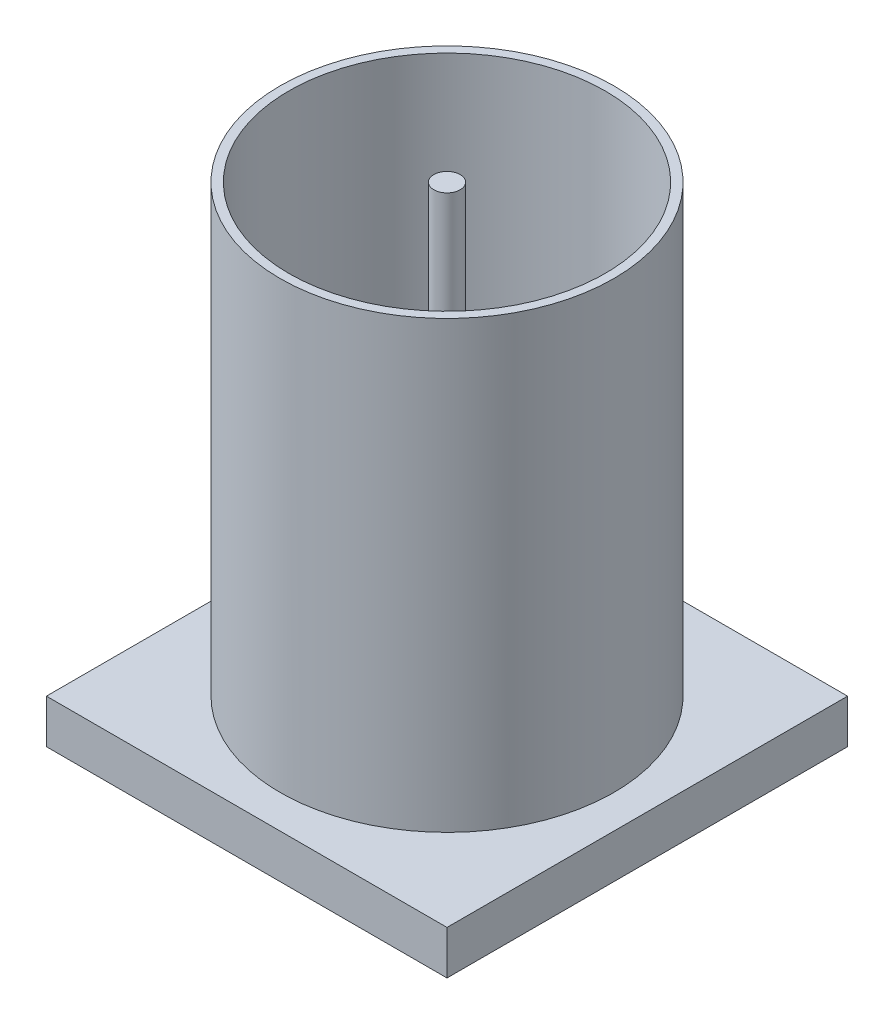
ISO-10303-21;
HEADER;
FILE_DESCRIPTION(('STEP AP214'),'2;1');
FILE_NAME('part.step','',(''),(''),'','','');
FILE_SCHEMA(('AUTOMOTIVE_DESIGN { 1 0 10303 214 1 1 1 1 }'));
ENDSEC;
DATA;
#1=APPLICATION_CONTEXT('core data for automotive mechanical design processes');
#2=APPLICATION_PROTOCOL_DEFINITION('international standard','automotive_design',2000,#1);
#3=PRODUCT_CONTEXT('',#1,'mechanical');
#4=PRODUCT('Part','Part','',(#3));
#5=PRODUCT_RELATED_PRODUCT_CATEGORY('part','',(#4));
#6=PRODUCT_DEFINITION_FORMATION('','',#4);
#7=PRODUCT_DEFINITION_CONTEXT('part definition',#1,'design');
#8=PRODUCT_DEFINITION('design','',#6,#7);
#9=PRODUCT_DEFINITION_SHAPE('','',#8);
#10=(LENGTH_UNIT() NAMED_UNIT(*) SI_UNIT(.MILLI.,.METRE.));
#11=(NAMED_UNIT(*) PLANE_ANGLE_UNIT() SI_UNIT($,.RADIAN.));
#12=(NAMED_UNIT(*) SI_UNIT($,.STERADIAN.) SOLID_ANGLE_UNIT());
#13=UNCERTAINTY_MEASURE_WITH_UNIT(LENGTH_MEASURE(1.E-05),#10,'distance_accuracy_value','');
#14=(GEOMETRIC_REPRESENTATION_CONTEXT(3) GLOBAL_UNCERTAINTY_ASSIGNED_CONTEXT((#13)) GLOBAL_UNIT_ASSIGNED_CONTEXT((#10,
#11,#12)) REPRESENTATION_CONTEXT('',''));
#15=CARTESIAN_POINT('',(0.,0.,0.));
#16=DIRECTION('',(0.,0.,1.));
#17=DIRECTION('',(1.,0.,0.));
#18=AXIS2_PLACEMENT_3D('',#15,#16,#17);
#19=CARTESIAN_POINT('',(0.,5.58,0.));
#20=DIRECTION('',(0.,-1.,0.));
#21=DIRECTION('',(0.,0.,-1.));
#22=AXIS2_PLACEMENT_3D('',#19,#20,#21);
#23=CYLINDRICAL_SURFACE('',#22,0.15);
#24=CARTESIAN_POINT('',(0.,5.58,0.));
#25=DIRECTION('',(0.,1.,0.));
#26=DIRECTION('',(0.,0.,1.));
#27=AXIS2_PLACEMENT_3D('',#24,#25,#26);
#28=CIRCLE('',#27,0.15);
#29=CARTESIAN_POINT('',(0.,5.58,0.15));
#30=VERTEX_POINT('',#29);
#31=EDGE_CURVE('E11',#30,#30,#28,.T.);
#32=ORIENTED_EDGE('',*,*,#31,.F.);
#33=EDGE_LOOP('',(#32));
#34=FACE_BOUND('',#33,.T.);
#35=CARTESIAN_POINT('',(0.,0.5,0.));
#36=DIRECTION('',(0.,1.,0.));
#37=DIRECTION('',(0.,0.,1.));
#38=AXIS2_PLACEMENT_3D('',#35,#36,#37);
#39=CIRCLE('',#38,0.15);
#40=CARTESIAN_POINT('',(0.,0.5,0.15));
#41=VERTEX_POINT('',#40);
#42=EDGE_CURVE('E52',#41,#41,#39,.T.);
#43=ORIENTED_EDGE('',*,*,#42,.T.);
#44=EDGE_LOOP('',(#43));
#45=FACE_BOUND('',#44,.T.);
#46=ADVANCED_FACE('F49',(#34,#45),#23,.T.);
#47=CARTESIAN_POINT('',(0.,5.58,0.));
#48=DIRECTION('',(0.,1.,0.));
#49=DIRECTION('',(0.,0.,1.));
#50=AXIS2_PLACEMENT_3D('',#47,#48,#49);
#51=PLANE('',#50);
#52=ORIENTED_EDGE('',*,*,#31,.T.);
#53=EDGE_LOOP('',(#52));
#54=FACE_BOUND('',#53,.T.);
#55=ADVANCED_FACE('F64',(#54),#51,.T.);
#56=CARTESIAN_POINT('',(0.,0.5,0.));
#57=DIRECTION('',(0.,1.,0.));
#58=DIRECTION('',(0.,0.,1.));
#59=AXIS2_PLACEMENT_3D('',#56,#57,#58);
#60=PLANE('',#59);
#61=ORIENTED_EDGE('',*,*,#42,.F.);
#62=EDGE_LOOP('',(#61));
#63=FACE_BOUND('',#62,.T.);
#64=ADVANCED_FACE('F62',(#63),#60,.F.);
#65=CLOSED_SHELL('',(#46,#55,#64));
#66=MANIFOLD_SOLID_BREP('B2',#65);
#67=CARTESIAN_POINT('',(0.,0.5,0.));
#68=DIRECTION('',(0.,-1.,0.));
#69=DIRECTION('',(0.,0.,-1.));
#70=AXIS2_PLACEMENT_3D('',#67,#68,#69);
#71=PLANE('',#70);
#72=DIRECTION('',(0.,0.,-1.));
#73=VECTOR('',#72,1.);
#74=CARTESIAN_POINT('',(2.286,0.5,2.286));
#75=LINE('',#74,#73);
#76=CARTESIAN_POINT('',(2.286,0.5,2.286));
#77=VERTEX_POINT('',#76);
#78=CARTESIAN_POINT('',(2.286,0.5,-2.286));
#79=VERTEX_POINT('',#78);
#80=EDGE_CURVE('E233',#77,#79,#75,.T.);
#81=ORIENTED_EDGE('',*,*,#80,.T.);
#82=DIRECTION('',(-1.,0.,0.));
#83=VECTOR('',#82,1.);
#84=CARTESIAN_POINT('',(-2.286,0.5,-2.286));
#85=LINE('',#84,#83);
#86=CARTESIAN_POINT('',(-2.286,0.5,-2.286));
#87=VERTEX_POINT('',#86);
#88=EDGE_CURVE('E140',#79,#87,#85,.T.);
#89=ORIENTED_EDGE('',*,*,#88,.T.);
#90=DIRECTION('',(0.,0.,1.));
#91=VECTOR('',#90,1.);
#92=CARTESIAN_POINT('',(-2.286,0.5,2.286));
#93=LINE('',#92,#91);
#94=CARTESIAN_POINT('',(-2.286,0.5,2.286));
#95=VERTEX_POINT('',#94);
#96=EDGE_CURVE('E238',#87,#95,#93,.T.);
#97=ORIENTED_EDGE('',*,*,#96,.T.);
#98=DIRECTION('',(1.,0.,0.));
#99=VECTOR('',#98,1.);
#100=CARTESIAN_POINT('',(-2.286,0.5,2.286));
#101=LINE('',#100,#99);
#102=EDGE_CURVE('E108',#95,#77,#101,.T.);
#103=ORIENTED_EDGE('',*,*,#102,.T.);
#104=EDGE_LOOP('',(#81,#89,#97,#103));
#105=FACE_BOUND('',#104,.T.);
#106=CARTESIAN_POINT('',(0.,0.5,0.));
#107=DIRECTION('',(0.,-1.,0.));
#108=DIRECTION('',(0.,0.,-1.));
#109=AXIS2_PLACEMENT_3D('',#106,#107,#108);
#110=CIRCLE('',#109,1.905);
#111=CARTESIAN_POINT('',(0.,0.5,-1.905));
#112=VERTEX_POINT('',#111);
#113=EDGE_CURVE('E47',#112,#112,#110,.F.);
#114=ORIENTED_EDGE('',*,*,#113,.F.);
#115=EDGE_LOOP('',(#114));
#116=FACE_BOUND('',#115,.T.);
#117=ADVANCED_FACE('F90',(#105,#116),#71,.F.);
#118=CARTESIAN_POINT('',(2.286,0.5,2.286));
#119=DIRECTION('',(-1.,0.,0.));
#120=DIRECTION('',(0.,0.,1.));
#121=AXIS2_PLACEMENT_3D('',#118,#119,#120);
#122=PLANE('',#121);
#123=DIRECTION('',(0.,0.,-1.));
#124=VECTOR('',#123,1.);
#125=CARTESIAN_POINT('',(2.286,0.,2.286));
#126=LINE('',#125,#124);
#127=CARTESIAN_POINT('',(2.286,0.,2.286));
#128=VERTEX_POINT('',#127);
#129=CARTESIAN_POINT('',(2.286,0.,-2.286));
#130=VERTEX_POINT('',#129);
#131=EDGE_CURVE('E232',#128,#130,#126,.T.);
#132=ORIENTED_EDGE('',*,*,#131,.T.);
#133=DIRECTION('',(0.,-1.,0.));
#134=VECTOR('',#133,1.);
#135=CARTESIAN_POINT('',(2.286,0.5,-2.286));
#136=LINE('',#135,#134);
#137=EDGE_CURVE('E100',#79,#130,#136,.T.);
#138=ORIENTED_EDGE('',*,*,#137,.F.);
#139=ORIENTED_EDGE('',*,*,#80,.F.);
#140=DIRECTION('',(0.,-1.,0.));
#141=VECTOR('',#140,1.);
#142=CARTESIAN_POINT('',(2.286,0.5,2.286));
#143=LINE('',#142,#141);
#144=EDGE_CURVE('E243',#77,#128,#143,.T.);
#145=ORIENTED_EDGE('',*,*,#144,.T.);
#146=EDGE_LOOP('',(#132,#138,#139,#145));
#147=FACE_BOUND('',#146,.T.);
#148=ADVANCED_FACE('F92',(#147),#122,.F.);
#149=CARTESIAN_POINT('',(-2.286,0.5,-2.286));
#150=DIRECTION('',(0.,0.,1.));
#151=DIRECTION('',(1.,0.,0.));
#152=AXIS2_PLACEMENT_3D('',#149,#150,#151);
#153=PLANE('',#152);
#154=DIRECTION('',(-1.,0.,0.));
#155=VECTOR('',#154,1.);
#156=CARTESIAN_POINT('',(-2.286,0.,-2.286));
#157=LINE('',#156,#155);
#158=CARTESIAN_POINT('',(-2.286,0.,-2.286));
#159=VERTEX_POINT('',#158);
#160=EDGE_CURVE('E247',#130,#159,#157,.T.);
#161=ORIENTED_EDGE('',*,*,#160,.T.);
#162=DIRECTION('',(0.,-1.,0.));
#163=VECTOR('',#162,1.);
#164=CARTESIAN_POINT('',(-2.286,0.5,-2.286));
#165=LINE('',#164,#163);
#166=EDGE_CURVE('E259',#87,#159,#165,.T.);
#167=ORIENTED_EDGE('',*,*,#166,.F.);
#168=ORIENTED_EDGE('',*,*,#88,.F.);
#169=ORIENTED_EDGE('',*,*,#137,.T.);
#170=EDGE_LOOP('',(#161,#167,#168,#169));
#171=FACE_BOUND('',#170,.T.);
#172=ADVANCED_FACE('F263',(#171),#153,.F.);
#173=CARTESIAN_POINT('',(-2.286,0.5,2.286));
#174=DIRECTION('',(1.,0.,0.));
#175=DIRECTION('',(0.,0.,-1.));
#176=AXIS2_PLACEMENT_3D('',#173,#174,#175);
#177=PLANE('',#176);
#178=DIRECTION('',(0.,0.,1.));
#179=VECTOR('',#178,1.);
#180=CARTESIAN_POINT('',(-2.286,0.,2.286));
#181=LINE('',#180,#179);
#182=CARTESIAN_POINT('',(-2.286,0.,2.286));
#183=VERTEX_POINT('',#182);
#184=EDGE_CURVE('E126',#159,#183,#181,.T.);
#185=ORIENTED_EDGE('',*,*,#184,.T.);
#186=DIRECTION('',(0.,-1.,0.));
#187=VECTOR('',#186,1.);
#188=CARTESIAN_POINT('',(-2.286,0.5,2.286));
#189=LINE('',#188,#187);
#190=EDGE_CURVE('E256',#95,#183,#189,.T.);
#191=ORIENTED_EDGE('',*,*,#190,.F.);
#192=ORIENTED_EDGE('',*,*,#96,.F.);
#193=ORIENTED_EDGE('',*,*,#166,.T.);
#194=EDGE_LOOP('',(#185,#191,#192,#193));
#195=FACE_BOUND('',#194,.T.);
#196=ADVANCED_FACE('F280',(#195),#177,.F.);
#197=CARTESIAN_POINT('',(-2.286,0.5,2.286));
#198=DIRECTION('',(0.,0.,-1.));
#199=DIRECTION('',(-1.,0.,0.));
#200=AXIS2_PLACEMENT_3D('',#197,#198,#199);
#201=PLANE('',#200);
#202=DIRECTION('',(1.,0.,0.));
#203=VECTOR('',#202,1.);
#204=CARTESIAN_POINT('',(-2.286,0.,2.286));
#205=LINE('',#204,#203);
#206=EDGE_CURVE('E132',#183,#128,#205,.T.);
#207=ORIENTED_EDGE('',*,*,#206,.T.);
#208=ORIENTED_EDGE('',*,*,#144,.F.);
#209=ORIENTED_EDGE('',*,*,#102,.F.);
#210=ORIENTED_EDGE('',*,*,#190,.T.);
#211=EDGE_LOOP('',(#207,#208,#209,#210));
#212=FACE_BOUND('',#211,.T.);
#213=ADVANCED_FACE('F271',(#212),#201,.F.);
#214=CARTESIAN_POINT('',(0.,0.,0.));
#215=DIRECTION('',(0.,-1.,0.));
#216=DIRECTION('',(0.,0.,-1.));
#217=AXIS2_PLACEMENT_3D('',#214,#215,#216);
#218=PLANE('',#217);
#219=ORIENTED_EDGE('',*,*,#131,.F.);
#220=ORIENTED_EDGE('',*,*,#206,.F.);
#221=ORIENTED_EDGE('',*,*,#184,.F.);
#222=ORIENTED_EDGE('',*,*,#160,.F.);
#223=EDGE_LOOP('',(#219,#220,#221,#222));
#224=FACE_BOUND('',#223,.T.);
#225=ADVANCED_FACE('F268',(#224),#218,.T.);
#226=CARTESIAN_POINT('',(0.,5.58,0.));
#227=DIRECTION('',(0.,-1.,0.));
#228=DIRECTION('',(0.,0.,-1.));
#229=AXIS2_PLACEMENT_3D('',#226,#227,#228);
#230=CYLINDRICAL_SURFACE('',#229,1.905);
#231=CARTESIAN_POINT('',(0.,5.58,0.));
#232=DIRECTION('',(0.,1.,0.));
#233=DIRECTION('',(0.,0.,1.));
#234=AXIS2_PLACEMENT_3D('',#231,#232,#233);
#235=CIRCLE('',#234,1.905);
#236=CARTESIAN_POINT('',(0.,5.58,1.905));
#237=VERTEX_POINT('',#236);
#238=EDGE_CURVE('E205',#237,#237,#235,.T.);
#239=ORIENTED_EDGE('',*,*,#238,.F.);
#240=EDGE_LOOP('',(#239));
#241=FACE_BOUND('',#240,.T.);
#242=ORIENTED_EDGE('',*,*,#113,.T.);
#243=EDGE_LOOP('',(#242));
#244=FACE_BOUND('',#243,.T.);
#245=ADVANCED_FACE('F270',(#241,#244),#230,.T.);
#246=CARTESIAN_POINT('',(0.,5.58,0.));
#247=DIRECTION('',(0.,1.,0.));
#248=DIRECTION('',(0.,0.,1.));
#249=AXIS2_PLACEMENT_3D('',#246,#247,#248);
#250=PLANE('',#249);
#251=CARTESIAN_POINT('',(0.,5.58,0.));
#252=DIRECTION('',(0.,1.,0.));
#253=DIRECTION('',(0.,0.,1.));
#254=AXIS2_PLACEMENT_3D('',#251,#252,#253);
#255=CIRCLE('',#254,1.805);
#256=CARTESIAN_POINT('',(0.,5.58,1.805));
#257=VERTEX_POINT('',#256);
#258=EDGE_CURVE('E211',#257,#257,#255,.T.);
#259=ORIENTED_EDGE('',*,*,#258,.F.);
#260=EDGE_LOOP('',(#259));
#261=FACE_BOUND('',#260,.T.);
#262=ORIENTED_EDGE('',*,*,#238,.T.);
#263=EDGE_LOOP('',(#262));
#264=FACE_BOUND('',#263,.T.);
#265=ADVANCED_FACE('F277',(#261,#264),#250,.T.);
#266=CARTESIAN_POINT('',(0.,0.4,0.));
#267=DIRECTION('',(0.,-1.,0.));
#268=DIRECTION('',(0.,0.,-1.));
#269=AXIS2_PLACEMENT_3D('',#266,#267,#268);
#270=PLANE('',#269);
#271=DIRECTION('',(0.,0.,-1.));
#272=VECTOR('',#271,1.);
#273=CARTESIAN_POINT('',(2.186,0.4,0.));
#274=LINE('',#273,#272);
#275=CARTESIAN_POINT('',(2.186,0.4,2.186));
#276=VERTEX_POINT('',#275);
#277=CARTESIAN_POINT('',(2.186,0.4,-2.186));
#278=VERTEX_POINT('',#277);
#279=EDGE_CURVE('E180',#276,#278,#274,.T.);
#280=ORIENTED_EDGE('',*,*,#279,.F.);
#281=DIRECTION('',(1.,0.,0.));
#282=VECTOR('',#281,1.);
#283=CARTESIAN_POINT('',(0.,0.4,2.186));
#284=LINE('',#283,#282);
#285=CARTESIAN_POINT('',(-2.186,0.4,2.186));
#286=VERTEX_POINT('',#285);
#287=EDGE_CURVE('E193',#286,#276,#284,.T.);
#288=ORIENTED_EDGE('',*,*,#287,.F.);
#289=DIRECTION('',(0.,0.,1.));
#290=VECTOR('',#289,1.);
#291=CARTESIAN_POINT('',(-2.186,0.4,0.));
#292=LINE('',#291,#290);
#293=CARTESIAN_POINT('',(-2.186,0.4,-2.186));
#294=VERTEX_POINT('',#293);
#295=EDGE_CURVE('E179',#294,#286,#292,.T.);
#296=ORIENTED_EDGE('',*,*,#295,.F.);
#297=DIRECTION('',(-1.,0.,0.));
#298=VECTOR('',#297,1.);
#299=CARTESIAN_POINT('',(0.,0.4,-2.186));
#300=LINE('',#299,#298);
#301=EDGE_CURVE('E167',#278,#294,#300,.T.);
#302=ORIENTED_EDGE('',*,*,#301,.F.);
#303=EDGE_LOOP('',(#280,#288,#296,#302));
#304=FACE_BOUND('',#303,.T.);
#305=CARTESIAN_POINT('',(0.,0.4,0.));
#306=DIRECTION('',(0.,-1.,0.));
#307=DIRECTION('',(0.,0.,-1.));
#308=AXIS2_PLACEMENT_3D('',#305,#306,#307);
#309=CIRCLE('',#308,1.805);
#310=CARTESIAN_POINT('',(0.,0.4,-1.805));
#311=VERTEX_POINT('',#310);
#312=EDGE_CURVE('E201',#311,#311,#309,.F.);
#313=ORIENTED_EDGE('',*,*,#312,.T.);
#314=EDGE_LOOP('',(#313));
#315=FACE_BOUND('',#314,.T.);
#316=ADVANCED_FACE('F191',(#304,#315),#270,.T.);
#317=CARTESIAN_POINT('',(2.186,0.5,2.286));
#318=DIRECTION('',(-1.,0.,0.));
#319=DIRECTION('',(0.,0.,1.));
#320=AXIS2_PLACEMENT_3D('',#317,#318,#319);
#321=PLANE('',#320);
#322=DIRECTION('',(0.,0.,-1.));
#323=VECTOR('',#322,1.);
#324=CARTESIAN_POINT('',(2.186,0.1,0.));
#325=LINE('',#324,#323);
#326=CARTESIAN_POINT('',(2.186,0.1,2.186));
#327=VERTEX_POINT('',#326);
#328=CARTESIAN_POINT('',(2.186,0.1,-2.186));
#329=VERTEX_POINT('',#328);
#330=EDGE_CURVE('E206',#327,#329,#325,.T.);
#331=ORIENTED_EDGE('',*,*,#330,.F.);
#332=DIRECTION('',(0.,-1.,0.));
#333=VECTOR('',#332,1.);
#334=CARTESIAN_POINT('',(2.186,0.5,2.186));
#335=LINE('',#334,#333);
#336=EDGE_CURVE('E197',#276,#327,#335,.T.);
#337=ORIENTED_EDGE('',*,*,#336,.F.);
#338=ORIENTED_EDGE('',*,*,#279,.T.);
#339=DIRECTION('',(0.,-1.,0.));
#340=VECTOR('',#339,1.);
#341=CARTESIAN_POINT('',(2.186,0.5,-2.186));
#342=LINE('',#341,#340);
#343=EDGE_CURVE('E173',#278,#329,#342,.T.);
#344=ORIENTED_EDGE('',*,*,#343,.T.);
#345=EDGE_LOOP('',(#331,#337,#338,#344));
#346=FACE_BOUND('',#345,.T.);
#347=ADVANCED_FACE('F308',(#346),#321,.T.);
#348=CARTESIAN_POINT('',(-2.286,0.5,-2.186));
#349=DIRECTION('',(0.,0.,1.));
#350=DIRECTION('',(1.,0.,0.));
#351=AXIS2_PLACEMENT_3D('',#348,#349,#350);
#352=PLANE('',#351);
#353=DIRECTION('',(-1.,0.,0.));
#354=VECTOR('',#353,1.);
#355=CARTESIAN_POINT('',(0.,0.1,-2.186));
#356=LINE('',#355,#354);
#357=CARTESIAN_POINT('',(-2.186,0.1,-2.186));
#358=VERTEX_POINT('',#357);
#359=EDGE_CURVE('E210',#329,#358,#356,.T.);
#360=ORIENTED_EDGE('',*,*,#359,.F.);
#361=ORIENTED_EDGE('',*,*,#343,.F.);
#362=ORIENTED_EDGE('',*,*,#301,.T.);
#363=DIRECTION('',(0.,-1.,0.));
#364=VECTOR('',#363,1.);
#365=CARTESIAN_POINT('',(-2.186,0.5,-2.186));
#366=LINE('',#365,#364);
#367=EDGE_CURVE('E170',#294,#358,#366,.T.);
#368=ORIENTED_EDGE('',*,*,#367,.T.);
#369=EDGE_LOOP('',(#360,#361,#362,#368));
#370=FACE_BOUND('',#369,.T.);
#371=ADVANCED_FACE('F169',(#370),#352,.T.);
#372=CARTESIAN_POINT('',(-2.186,0.5,2.286));
#373=DIRECTION('',(1.,0.,0.));
#374=DIRECTION('',(0.,0.,-1.));
#375=AXIS2_PLACEMENT_3D('',#372,#373,#374);
#376=PLANE('',#375);
#377=DIRECTION('',(0.,0.,1.));
#378=VECTOR('',#377,1.);
#379=CARTESIAN_POINT('',(-2.186,0.1,0.));
#380=LINE('',#379,#378);
#381=CARTESIAN_POINT('',(-2.186,0.1,2.186));
#382=VERTEX_POINT('',#381);
#383=EDGE_CURVE('E186',#358,#382,#380,.T.);
#384=ORIENTED_EDGE('',*,*,#383,.F.);
#385=ORIENTED_EDGE('',*,*,#367,.F.);
#386=ORIENTED_EDGE('',*,*,#295,.T.);
#387=DIRECTION('',(0.,-1.,0.));
#388=VECTOR('',#387,1.);
#389=CARTESIAN_POINT('',(-2.186,0.5,2.186));
#390=LINE('',#389,#388);
#391=EDGE_CURVE('E188',#286,#382,#390,.T.);
#392=ORIENTED_EDGE('',*,*,#391,.T.);
#393=EDGE_LOOP('',(#384,#385,#386,#392));
#394=FACE_BOUND('',#393,.T.);
#395=ADVANCED_FACE('F183',(#394),#376,.T.);
#396=CARTESIAN_POINT('',(-2.286,0.5,2.186));
#397=DIRECTION('',(0.,0.,-1.));
#398=DIRECTION('',(-1.,0.,0.));
#399=AXIS2_PLACEMENT_3D('',#396,#397,#398);
#400=PLANE('',#399);
#401=DIRECTION('',(1.,0.,0.));
#402=VECTOR('',#401,1.);
#403=CARTESIAN_POINT('',(0.,0.1,2.186));
#404=LINE('',#403,#402);
#405=EDGE_CURVE('E221',#382,#327,#404,.T.);
#406=ORIENTED_EDGE('',*,*,#405,.F.);
#407=ORIENTED_EDGE('',*,*,#391,.F.);
#408=ORIENTED_EDGE('',*,*,#287,.T.);
#409=ORIENTED_EDGE('',*,*,#336,.T.);
#410=EDGE_LOOP('',(#406,#407,#408,#409));
#411=FACE_BOUND('',#410,.T.);
#412=ADVANCED_FACE('F299',(#411),#400,.T.);
#413=CARTESIAN_POINT('',(0.,0.1,0.));
#414=DIRECTION('',(0.,-1.,0.));
#415=DIRECTION('',(0.,0.,-1.));
#416=AXIS2_PLACEMENT_3D('',#413,#414,#415);
#417=PLANE('',#416);
#418=ORIENTED_EDGE('',*,*,#330,.T.);
#419=ORIENTED_EDGE('',*,*,#359,.T.);
#420=ORIENTED_EDGE('',*,*,#383,.T.);
#421=ORIENTED_EDGE('',*,*,#405,.T.);
#422=EDGE_LOOP('',(#418,#419,#420,#421));
#423=FACE_BOUND('',#422,.T.);
#424=ADVANCED_FACE('F295',(#423),#417,.F.);
#425=CARTESIAN_POINT('',(0.,5.58,0.));
#426=DIRECTION('',(0.,-1.,0.));
#427=DIRECTION('',(0.,0.,-1.));
#428=AXIS2_PLACEMENT_3D('',#425,#426,#427);
#429=CYLINDRICAL_SURFACE('',#428,1.805);
#430=ORIENTED_EDGE('',*,*,#258,.T.);
#431=EDGE_LOOP('',(#430));
#432=FACE_BOUND('',#431,.T.);
#433=ORIENTED_EDGE('',*,*,#312,.F.);
#434=EDGE_LOOP('',(#433));
#435=FACE_BOUND('',#434,.T.);
#436=ADVANCED_FACE('F292',(#432,#435),#429,.F.);
#437=CLOSED_SHELL('',(#117,#148,#172,#196,#213,#225,#245,#265,#316,#347,#371,#395,#412,#424,#436));
#438=MANIFOLD_SOLID_BREP('B6',#437);
#439=ADVANCED_BREP_SHAPE_REPRESENTATION('',(#18,#66,#438),#14);
#440=SHAPE_DEFINITION_REPRESENTATION(#9,#439);
ENDSEC;
END-ISO-10303-21;
